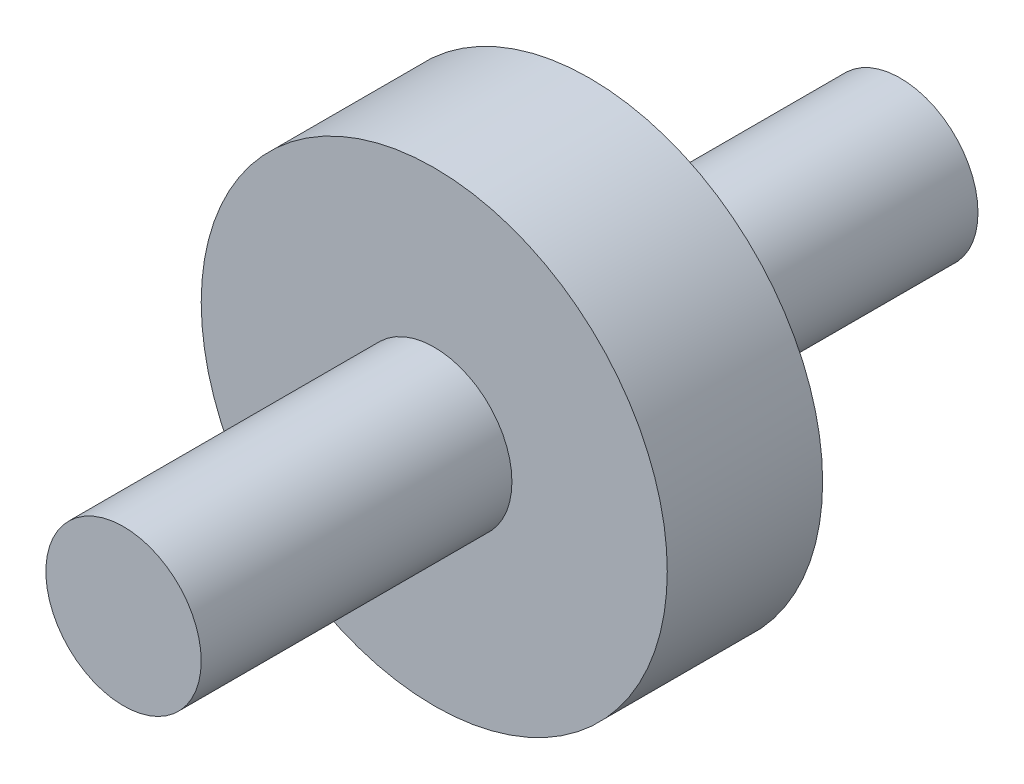
ISO-10303-21;
HEADER;
FILE_DESCRIPTION(('STEP AP214'),'2;1');
FILE_NAME('part.step','',(''),(''),'','','');
FILE_SCHEMA(('AUTOMOTIVE_DESIGN { 1 0 10303 214 1 1 1 1 }'));
ENDSEC;
DATA;
#1=APPLICATION_CONTEXT('core data for automotive mechanical design processes');
#2=APPLICATION_PROTOCOL_DEFINITION('international standard','automotive_design',2000,#1);
#3=PRODUCT_CONTEXT('',#1,'mechanical');
#4=PRODUCT('Part','Part','',(#3));
#5=PRODUCT_RELATED_PRODUCT_CATEGORY('part','',(#4));
#6=PRODUCT_DEFINITION_FORMATION('','',#4);
#7=PRODUCT_DEFINITION_CONTEXT('part definition',#1,'design');
#8=PRODUCT_DEFINITION('design','',#6,#7);
#9=PRODUCT_DEFINITION_SHAPE('','',#8);
#10=(LENGTH_UNIT() NAMED_UNIT(*) SI_UNIT(.MILLI.,.METRE.));
#11=(NAMED_UNIT(*) PLANE_ANGLE_UNIT() SI_UNIT($,.RADIAN.));
#12=(NAMED_UNIT(*) SI_UNIT($,.STERADIAN.) SOLID_ANGLE_UNIT());
#13=UNCERTAINTY_MEASURE_WITH_UNIT(LENGTH_MEASURE(1.E-05),#10,'distance_accuracy_value','');
#14=(GEOMETRIC_REPRESENTATION_CONTEXT(3) GLOBAL_UNCERTAINTY_ASSIGNED_CONTEXT((#13)) GLOBAL_UNIT_ASSIGNED_CONTEXT((#10,
#11,#12)) REPRESENTATION_CONTEXT('',''));
#15=CARTESIAN_POINT('',(0.,0.,0.));
#16=DIRECTION('',(0.,0.,1.));
#17=DIRECTION('',(1.,0.,0.));
#18=AXIS2_PLACEMENT_3D('',#15,#16,#17);
#19=CARTESIAN_POINT('',(0.,0.,10.));
#20=DIRECTION('',(0.,0.,-1.));
#21=DIRECTION('',(-1.,0.,0.));
#22=AXIS2_PLACEMENT_3D('',#19,#20,#21);
#23=CYLINDRICAL_SURFACE('',#22,15.);
#24=CARTESIAN_POINT('',(0.,0.,10.));
#25=DIRECTION('',(0.,0.,1.));
#26=DIRECTION('',(1.,0.,0.));
#27=AXIS2_PLACEMENT_3D('',#24,#25,#26);
#28=CIRCLE('',#27,15.);
#29=CARTESIAN_POINT('',(15.,0.,10.));
#30=VERTEX_POINT('',#29);
#31=EDGE_CURVE('E37',#30,#30,#28,.T.);
#32=ORIENTED_EDGE('',*,*,#31,.F.);
#33=EDGE_LOOP('',(#32));
#34=FACE_BOUND('',#33,.T.);
#35=CARTESIAN_POINT('',(0.,0.,0.));
#36=DIRECTION('',(0.,0.,1.));
#37=DIRECTION('',(1.,0.,0.));
#38=AXIS2_PLACEMENT_3D('',#35,#36,#37);
#39=CIRCLE('',#38,15.);
#40=CARTESIAN_POINT('',(15.,0.,0.));
#41=VERTEX_POINT('',#40);
#42=EDGE_CURVE('E41',#41,#41,#39,.T.);
#43=ORIENTED_EDGE('',*,*,#42,.T.);
#44=EDGE_LOOP('',(#43));
#45=FACE_BOUND('',#44,.T.);
#46=ADVANCED_FACE('F31',(#34,#45),#23,.T.);
#47=CARTESIAN_POINT('',(0.,0.,10.));
#48=DIRECTION('',(0.,0.,1.));
#49=DIRECTION('',(1.,0.,0.));
#50=AXIS2_PLACEMENT_3D('',#47,#48,#49);
#51=PLANE('',#50);
#52=CARTESIAN_POINT('',(0.,0.,10.));
#53=DIRECTION('',(0.,0.,1.));
#54=DIRECTION('',(1.,0.,0.));
#55=AXIS2_PLACEMENT_3D('',#52,#53,#54);
#56=CIRCLE('',#55,5.);
#57=CARTESIAN_POINT('',(5.,0.,10.));
#58=VERTEX_POINT('',#57);
#59=EDGE_CURVE('E46',#58,#58,#56,.F.);
#60=ORIENTED_EDGE('',*,*,#59,.T.);
#61=EDGE_LOOP('',(#60));
#62=FACE_BOUND('',#61,.T.);
#63=ORIENTED_EDGE('',*,*,#31,.T.);
#64=EDGE_LOOP('',(#63));
#65=FACE_BOUND('',#64,.T.);
#66=ADVANCED_FACE('F69',(#62,#65),#51,.T.);
#67=CARTESIAN_POINT('',(0.,0.,0.));
#68=DIRECTION('',(0.,0.,1.));
#69=DIRECTION('',(1.,0.,0.));
#70=AXIS2_PLACEMENT_3D('',#67,#68,#69);
#71=PLANE('',#70);
#72=CARTESIAN_POINT('',(0.,0.,0.));
#73=DIRECTION('',(0.,0.,1.));
#74=DIRECTION('',(1.,0.,0.));
#75=AXIS2_PLACEMENT_3D('',#72,#73,#74);
#76=CIRCLE('',#75,5.);
#77=CARTESIAN_POINT('',(5.,0.,0.));
#78=VERTEX_POINT('',#77);
#79=EDGE_CURVE('E10',#78,#78,#76,.F.);
#80=ORIENTED_EDGE('',*,*,#79,.F.);
#81=EDGE_LOOP('',(#80));
#82=FACE_BOUND('',#81,.T.);
#83=ORIENTED_EDGE('',*,*,#42,.F.);
#84=EDGE_LOOP('',(#83));
#85=FACE_BOUND('',#84,.T.);
#86=ADVANCED_FACE('F61',(#82,#85),#71,.F.);
#87=CARTESIAN_POINT('',(0.,0.,-20.));
#88=DIRECTION('',(0.,0.,1.));
#89=DIRECTION('',(1.,0.,0.));
#90=AXIS2_PLACEMENT_3D('',#87,#88,#89);
#91=PLANE('',#90);
#92=CARTESIAN_POINT('',(0.,0.,-20.));
#93=DIRECTION('',(0.,0.,1.));
#94=DIRECTION('',(1.,0.,0.));
#95=AXIS2_PLACEMENT_3D('',#92,#93,#94);
#96=CIRCLE('',#95,5.);
#97=CARTESIAN_POINT('',(5.,0.,-20.));
#98=VERTEX_POINT('',#97);
#99=EDGE_CURVE('E53',#98,#98,#96,.T.);
#100=ORIENTED_EDGE('',*,*,#99,.F.);
#101=EDGE_LOOP('',(#100));
#102=FACE_BOUND('',#101,.T.);
#103=ADVANCED_FACE('F59',(#102),#91,.F.);
#104=CARTESIAN_POINT('',(0.,0.,30.));
#105=DIRECTION('',(0.,0.,-1.));
#106=DIRECTION('',(-1.,0.,0.));
#107=AXIS2_PLACEMENT_3D('',#104,#105,#106);
#108=CYLINDRICAL_SURFACE('',#107,5.);
#109=ORIENTED_EDGE('',*,*,#99,.T.);
#110=EDGE_LOOP('',(#109));
#111=FACE_BOUND('',#110,.T.);
#112=ORIENTED_EDGE('',*,*,#79,.T.);
#113=EDGE_LOOP('',(#112));
#114=FACE_BOUND('',#113,.T.);
#115=ADVANCED_FACE('F57',(#111,#114),#108,.T.);
#116=ORIENTED_EDGE('',*,*,#59,.F.);
#117=EDGE_LOOP('',(#116));
#118=FACE_BOUND('',#117,.T.);
#119=CARTESIAN_POINT('',(0.,0.,30.));
#120=DIRECTION('',(0.,0.,1.));
#121=DIRECTION('',(1.,0.,0.));
#122=AXIS2_PLACEMENT_3D('',#119,#120,#121);
#123=CIRCLE('',#122,5.);
#124=CARTESIAN_POINT('',(5.,0.,30.));
#125=VERTEX_POINT('',#124);
#126=EDGE_CURVE('E50',#125,#125,#123,.T.);
#127=ORIENTED_EDGE('',*,*,#126,.F.);
#128=EDGE_LOOP('',(#127));
#129=FACE_BOUND('',#128,.T.);
#130=ADVANCED_FACE('F67',(#118,#129),#108,.T.);
#131=CARTESIAN_POINT('',(0.,0.,30.));
#132=DIRECTION('',(0.,0.,1.));
#133=DIRECTION('',(1.,0.,0.));
#134=AXIS2_PLACEMENT_3D('',#131,#132,#133);
#135=PLANE('',#134);
#136=ORIENTED_EDGE('',*,*,#126,.T.);
#137=EDGE_LOOP('',(#136));
#138=FACE_BOUND('',#137,.T.);
#139=ADVANCED_FACE('F85',(#138),#135,.T.);
#140=CLOSED_SHELL('',(#46,#66,#86,#103,#115,#130,#139));
#141=MANIFOLD_SOLID_BREP('B2',#140);
#142=ADVANCED_BREP_SHAPE_REPRESENTATION('',(#18,#141),#14);
#143=SHAPE_DEFINITION_REPRESENTATION(#9,#142);
ENDSEC;
END-ISO-10303-21;
